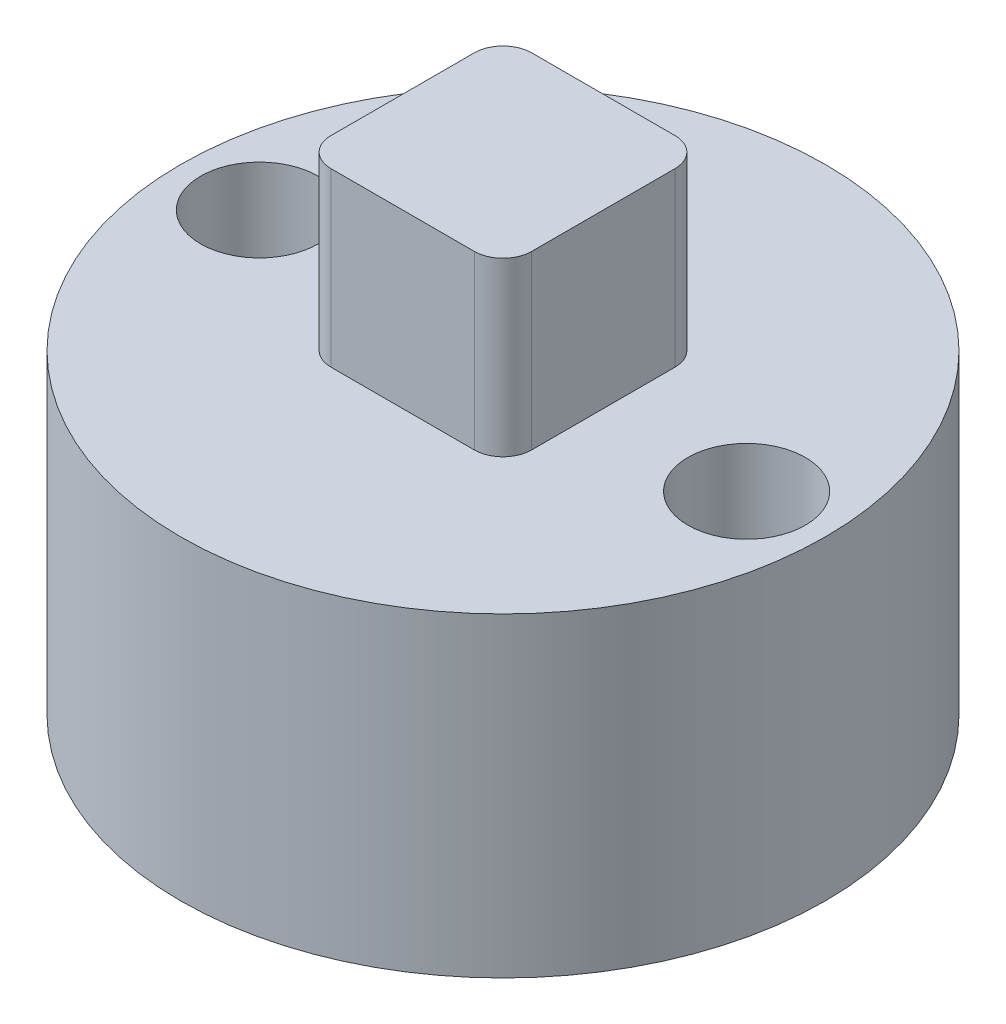
ISO-10303-21;
HEADER;
FILE_DESCRIPTION(('STEP AP214'),'2;1');
FILE_NAME('part.step','',(''),(''),'','','');
FILE_SCHEMA(('AUTOMOTIVE_DESIGN { 1 0 10303 214 1 1 1 1 }'));
ENDSEC;
DATA;
#1=APPLICATION_CONTEXT('core data for automotive mechanical design processes');
#2=APPLICATION_PROTOCOL_DEFINITION('international standard','automotive_design',2000,#1);
#3=PRODUCT_CONTEXT('',#1,'mechanical');
#4=PRODUCT('Part','Part','',(#3));
#5=PRODUCT_RELATED_PRODUCT_CATEGORY('part','',(#4));
#6=PRODUCT_DEFINITION_FORMATION('','',#4);
#7=PRODUCT_DEFINITION_CONTEXT('part definition',#1,'design');
#8=PRODUCT_DEFINITION('design','',#6,#7);
#9=PRODUCT_DEFINITION_SHAPE('','',#8);
#10=(LENGTH_UNIT() NAMED_UNIT(*) SI_UNIT(.MILLI.,.METRE.));
#11=(NAMED_UNIT(*) PLANE_ANGLE_UNIT() SI_UNIT($,.RADIAN.));
#12=(NAMED_UNIT(*) SI_UNIT($,.STERADIAN.) SOLID_ANGLE_UNIT());
#13=UNCERTAINTY_MEASURE_WITH_UNIT(LENGTH_MEASURE(1.E-05),#10,'distance_accuracy_value','');
#14=(GEOMETRIC_REPRESENTATION_CONTEXT(3) GLOBAL_UNCERTAINTY_ASSIGNED_CONTEXT((#13)) GLOBAL_UNIT_ASSIGNED_CONTEXT((#10,
#11,#12)) REPRESENTATION_CONTEXT('',''));
#15=CARTESIAN_POINT('',(0.,0.,0.));
#16=DIRECTION('',(0.,0.,1.));
#17=DIRECTION('',(1.,0.,0.));
#18=AXIS2_PLACEMENT_3D('',#15,#16,#17);
#19=CARTESIAN_POINT('',(-8.5,11.,0.));
#20=DIRECTION('',(0.,-1.,0.));
#21=DIRECTION('',(0.,0.,-1.));
#22=AXIS2_PLACEMENT_3D('',#19,#20,#21);
#23=CYLINDRICAL_SURFACE('',#22,1.15);
#24=CARTESIAN_POINT('',(-8.5,0.,0.));
#25=DIRECTION('',(0.,-1.,0.));
#26=DIRECTION('',(0.,0.,1.));
#27=AXIS2_PLACEMENT_3D('',#24,#25,#26);
#28=CIRCLE('',#27,1.15);
#29=CARTESIAN_POINT('',(-8.5,0.,1.15));
#30=VERTEX_POINT('',#29);
#31=EDGE_CURVE('E139',#30,#30,#28,.T.);
#32=ORIENTED_EDGE('',*,*,#31,.T.);
#33=EDGE_LOOP('',(#32));
#34=FACE_BOUND('',#33,.T.);
#35=CARTESIAN_POINT('',(-8.5,1.5,0.));
#36=DIRECTION('',(0.,1.,0.));
#37=DIRECTION('',(0.,0.,1.));
#38=AXIS2_PLACEMENT_3D('',#35,#36,#37);
#39=CIRCLE('',#38,1.15);
#40=CARTESIAN_POINT('',(-8.5,1.5,1.15));
#41=VERTEX_POINT('',#40);
#42=EDGE_CURVE('E150',#41,#41,#39,.F.);
#43=ORIENTED_EDGE('',*,*,#42,.F.);
#44=EDGE_LOOP('',(#43));
#45=FACE_BOUND('',#44,.T.);
#46=ADVANCED_FACE('F37',(#34,#45),#23,.F.);
#47=CARTESIAN_POINT('',(8.5,11.,0.));
#48=DIRECTION('',(0.,-1.,0.));
#49=DIRECTION('',(0.,0.,-1.));
#50=AXIS2_PLACEMENT_3D('',#47,#48,#49);
#51=CYLINDRICAL_SURFACE('',#50,1.15);
#52=CARTESIAN_POINT('',(8.5,0.,0.));
#53=DIRECTION('',(0.,-1.,0.));
#54=DIRECTION('',(0.,0.,-1.));
#55=AXIS2_PLACEMENT_3D('',#52,#53,#54);
#56=CIRCLE('',#55,1.15);
#57=CARTESIAN_POINT('',(8.5,0.,-1.15));
#58=VERTEX_POINT('',#57);
#59=EDGE_CURVE('E135',#58,#58,#56,.T.);
#60=ORIENTED_EDGE('',*,*,#59,.T.);
#61=EDGE_LOOP('',(#60));
#62=FACE_BOUND('',#61,.T.);
#63=CARTESIAN_POINT('',(8.5,1.5,0.));
#64=DIRECTION('',(0.,1.,0.));
#65=DIRECTION('',(0.,0.,1.));
#66=AXIS2_PLACEMENT_3D('',#63,#64,#65);
#67=CIRCLE('',#66,1.15);
#68=CARTESIAN_POINT('',(8.5,1.5,1.15));
#69=VERTEX_POINT('',#68);
#70=EDGE_CURVE('E147',#69,#69,#67,.F.);
#71=ORIENTED_EDGE('',*,*,#70,.F.);
#72=EDGE_LOOP('',(#71));
#73=FACE_BOUND('',#72,.T.);
#74=ADVANCED_FACE('F211',(#62,#73),#51,.F.);
#75=CARTESIAN_POINT('',(0.,11.,0.));
#76=DIRECTION('',(0.,1.,0.));
#77=DIRECTION('',(0.,0.,1.));
#78=AXIS2_PLACEMENT_3D('',#75,#76,#77);
#79=PLANE('',#78);
#80=CARTESIAN_POINT('',(8.5,11.,0.));
#81=DIRECTION('',(0.,1.,0.));
#82=DIRECTION('',(0.,0.,1.));
#83=AXIS2_PLACEMENT_3D('',#80,#81,#82);
#84=CIRCLE('',#83,2.05);
#85=CARTESIAN_POINT('',(8.5,11.,2.05));
#86=VERTEX_POINT('',#85);
#87=EDGE_CURVE('E368',#86,#86,#84,.T.);
#88=ORIENTED_EDGE('',*,*,#87,.F.);
#89=EDGE_LOOP('',(#88));
#90=FACE_BOUND('',#89,.T.);
#91=CARTESIAN_POINT('',(-8.5,11.,0.));
#92=DIRECTION('',(0.,1.,0.));
#93=DIRECTION('',(0.,0.,1.));
#94=AXIS2_PLACEMENT_3D('',#91,#92,#93);
#95=CIRCLE('',#94,2.05);
#96=CARTESIAN_POINT('',(-8.5,11.,2.05));
#97=VERTEX_POINT('',#96);
#98=EDGE_CURVE('E374',#97,#97,#95,.T.);
#99=ORIENTED_EDGE('',*,*,#98,.F.);
#100=EDGE_LOOP('',(#99));
#101=FACE_BOUND('',#100,.T.);
#102=CARTESIAN_POINT('',(0.,11.,0.));
#103=DIRECTION('',(0.,1.,0.));
#104=DIRECTION('',(0.,0.,1.));
#105=AXIS2_PLACEMENT_3D('',#102,#103,#104);
#106=CIRCLE('',#105,11.25);
#107=CARTESIAN_POINT('',(0.,11.,11.25));
#108=VERTEX_POINT('',#107);
#109=EDGE_CURVE('E142',#108,#108,#106,.T.);
#110=ORIENTED_EDGE('',*,*,#109,.T.);
#111=EDGE_LOOP('',(#110));
#112=FACE_BOUND('',#111,.T.);
#113=DIRECTION('',(-1.,0.,0.));
#114=VECTOR('',#113,1.);
#115=CARTESIAN_POINT('',(-3.5,11.,-3.5));
#116=LINE('',#115,#114);
#117=CARTESIAN_POINT('',(2.5,11.,-3.5));
#118=VERTEX_POINT('',#117);
#119=CARTESIAN_POINT('',(-2.5,11.,-3.5));
#120=VERTEX_POINT('',#119);
#121=EDGE_CURVE('E131',#118,#120,#116,.T.);
#122=ORIENTED_EDGE('',*,*,#121,.F.);
#123=CARTESIAN_POINT('',(2.5,11.,-2.5));
#124=DIRECTION('',(0.,1.,0.));
#125=DIRECTION('',(0.,0.,1.));
#126=AXIS2_PLACEMENT_3D('',#123,#124,#125);
#127=CIRCLE('',#126,1.);
#128=CARTESIAN_POINT('',(3.5,11.,-2.5));
#129=VERTEX_POINT('',#128);
#130=EDGE_CURVE('E45',#118,#129,#127,.F.);
#131=ORIENTED_EDGE('',*,*,#130,.T.);
#132=DIRECTION('',(0.,0.,-1.));
#133=VECTOR('',#132,1.);
#134=CARTESIAN_POINT('',(3.5,11.,3.5));
#135=LINE('',#134,#133);
#136=CARTESIAN_POINT('',(3.5,11.,2.5));
#137=VERTEX_POINT('',#136);
#138=EDGE_CURVE('E154',#137,#129,#135,.T.);
#139=ORIENTED_EDGE('',*,*,#138,.F.);
#140=CARTESIAN_POINT('',(2.5,11.,2.5));
#141=DIRECTION('',(0.,1.,0.));
#142=DIRECTION('',(0.,0.,1.));
#143=AXIS2_PLACEMENT_3D('',#140,#141,#142);
#144=CIRCLE('',#143,1.);
#145=CARTESIAN_POINT('',(2.5,11.,3.5));
#146=VERTEX_POINT('',#145);
#147=EDGE_CURVE('E109',#137,#146,#144,.F.);
#148=ORIENTED_EDGE('',*,*,#147,.T.);
#149=DIRECTION('',(1.,0.,0.));
#150=VECTOR('',#149,1.);
#151=CARTESIAN_POINT('',(-3.5,11.,3.5));
#152=LINE('',#151,#150);
#153=CARTESIAN_POINT('',(-2.5,11.,3.5));
#154=VERTEX_POINT('',#153);
#155=EDGE_CURVE('E116',#154,#146,#152,.T.);
#156=ORIENTED_EDGE('',*,*,#155,.F.);
#157=CARTESIAN_POINT('',(-2.5,11.,2.5));
#158=DIRECTION('',(0.,1.,0.));
#159=DIRECTION('',(0.,0.,1.));
#160=AXIS2_PLACEMENT_3D('',#157,#158,#159);
#161=CIRCLE('',#160,1.);
#162=CARTESIAN_POINT('',(-3.5,11.,2.5));
#163=VERTEX_POINT('',#162);
#164=EDGE_CURVE('E101',#154,#163,#161,.F.);
#165=ORIENTED_EDGE('',*,*,#164,.T.);
#166=DIRECTION('',(0.,0.,1.));
#167=VECTOR('',#166,1.);
#168=CARTESIAN_POINT('',(-3.5,11.,3.5));
#169=LINE('',#168,#167);
#170=CARTESIAN_POINT('',(-3.5,11.,-2.5));
#171=VERTEX_POINT('',#170);
#172=EDGE_CURVE('E126',#171,#163,#169,.T.);
#173=ORIENTED_EDGE('',*,*,#172,.F.);
#174=CARTESIAN_POINT('',(-2.5,11.,-2.5));
#175=DIRECTION('',(0.,1.,0.));
#176=DIRECTION('',(0.,0.,1.));
#177=AXIS2_PLACEMENT_3D('',#174,#175,#176);
#178=CIRCLE('',#177,1.);
#179=EDGE_CURVE('E12',#171,#120,#178,.F.);
#180=ORIENTED_EDGE('',*,*,#179,.T.);
#181=EDGE_LOOP('',(#122,#131,#139,#148,#156,#165,#173,#180));
#182=FACE_BOUND('',#181,.T.);
#183=ADVANCED_FACE('F123',(#90,#101,#112,#182),#79,.T.);
#184=CARTESIAN_POINT('',(0.,11.,0.));
#185=DIRECTION('',(0.,-1.,0.));
#186=DIRECTION('',(0.,0.,-1.));
#187=AXIS2_PLACEMENT_3D('',#184,#185,#186);
#188=CYLINDRICAL_SURFACE('',#187,11.25);
#189=ORIENTED_EDGE('',*,*,#109,.F.);
#190=EDGE_LOOP('',(#189));
#191=FACE_BOUND('',#190,.T.);
#192=CARTESIAN_POINT('',(0.,0.,0.));
#193=DIRECTION('',(0.,1.,0.));
#194=DIRECTION('',(0.,0.,1.));
#195=AXIS2_PLACEMENT_3D('',#192,#193,#194);
#196=CIRCLE('',#195,11.25);
#197=CARTESIAN_POINT('',(0.,0.,11.25));
#198=VERTEX_POINT('',#197);
#199=EDGE_CURVE('E138',#198,#198,#196,.T.);
#200=ORIENTED_EDGE('',*,*,#199,.T.);
#201=EDGE_LOOP('',(#200));
#202=FACE_BOUND('',#201,.T.);
#203=ADVANCED_FACE('F224',(#191,#202),#188,.T.);
#204=CARTESIAN_POINT('',(0.,0.,0.));
#205=DIRECTION('',(0.,1.,0.));
#206=DIRECTION('',(0.,0.,1.));
#207=AXIS2_PLACEMENT_3D('',#204,#205,#206);
#208=PLANE('',#207);
#209=ORIENTED_EDGE('',*,*,#59,.F.);
#210=EDGE_LOOP('',(#209));
#211=FACE_BOUND('',#210,.T.);
#212=ORIENTED_EDGE('',*,*,#31,.F.);
#213=EDGE_LOOP('',(#212));
#214=FACE_BOUND('',#213,.T.);
#215=ORIENTED_EDGE('',*,*,#199,.F.);
#216=EDGE_LOOP('',(#215));
#217=FACE_BOUND('',#216,.T.);
#218=ADVANCED_FACE('F226',(#211,#214,#217),#208,.F.);
#219=CARTESIAN_POINT('',(3.5,17.,3.5));
#220=DIRECTION('',(-1.,0.,0.));
#221=DIRECTION('',(0.,0.,1.));
#222=AXIS2_PLACEMENT_3D('',#219,#220,#221);
#223=PLANE('',#222);
#224=DIRECTION('',(0.,0.,-1.));
#225=VECTOR('',#224,1.);
#226=CARTESIAN_POINT('',(3.5,17.,3.5));
#227=LINE('',#226,#225);
#228=CARTESIAN_POINT('',(3.5,17.,2.5));
#229=VERTEX_POINT('',#228);
#230=CARTESIAN_POINT('',(3.5,17.,-2.5));
#231=VERTEX_POINT('',#230);
#232=EDGE_CURVE('E125',#229,#231,#227,.T.);
#233=ORIENTED_EDGE('',*,*,#232,.F.);
#234=DIRECTION('',(0.,-1.,0.));
#235=VECTOR('',#234,1.);
#236=CARTESIAN_POINT('',(3.5,17.,2.5));
#237=LINE('',#236,#235);
#238=EDGE_CURVE('E169',#229,#137,#237,.T.);
#239=ORIENTED_EDGE('',*,*,#238,.T.);
#240=ORIENTED_EDGE('',*,*,#138,.T.);
#241=DIRECTION('',(0.,-1.,0.));
#242=VECTOR('',#241,1.);
#243=CARTESIAN_POINT('',(3.5,17.,-2.5));
#244=LINE('',#243,#242);
#245=EDGE_CURVE('E167',#129,#231,#244,.F.);
#246=ORIENTED_EDGE('',*,*,#245,.T.);
#247=EDGE_LOOP('',(#233,#239,#240,#246));
#248=FACE_BOUND('',#247,.T.);
#249=ADVANCED_FACE('F178',(#248),#223,.F.);
#250=CARTESIAN_POINT('',(-3.5,17.,-3.5));
#251=DIRECTION('',(0.,0.,1.));
#252=DIRECTION('',(1.,0.,0.));
#253=AXIS2_PLACEMENT_3D('',#250,#251,#252);
#254=PLANE('',#253);
#255=DIRECTION('',(-1.,0.,0.));
#256=VECTOR('',#255,1.);
#257=CARTESIAN_POINT('',(-3.5,17.,-3.5));
#258=LINE('',#257,#256);
#259=CARTESIAN_POINT('',(2.5,17.,-3.5));
#260=VERTEX_POINT('',#259);
#261=CARTESIAN_POINT('',(-2.5,17.,-3.5));
#262=VERTEX_POINT('',#261);
#263=EDGE_CURVE('E129',#260,#262,#258,.T.);
#264=ORIENTED_EDGE('',*,*,#263,.F.);
#265=DIRECTION('',(0.,-1.,0.));
#266=VECTOR('',#265,1.);
#267=CARTESIAN_POINT('',(2.5,17.,-3.5));
#268=LINE('',#267,#266);
#269=EDGE_CURVE('E110',#260,#118,#268,.T.);
#270=ORIENTED_EDGE('',*,*,#269,.T.);
#271=ORIENTED_EDGE('',*,*,#121,.T.);
#272=DIRECTION('',(0.,-1.,0.));
#273=VECTOR('',#272,1.);
#274=CARTESIAN_POINT('',(-2.5,17.,-3.5));
#275=LINE('',#274,#273);
#276=EDGE_CURVE('E172',#120,#262,#275,.F.);
#277=ORIENTED_EDGE('',*,*,#276,.T.);
#278=EDGE_LOOP('',(#264,#270,#271,#277));
#279=FACE_BOUND('',#278,.T.);
#280=ADVANCED_FACE('F190',(#279),#254,.F.);
#281=CARTESIAN_POINT('',(-3.5,17.,3.5));
#282=DIRECTION('',(1.,0.,0.));
#283=DIRECTION('',(0.,0.,-1.));
#284=AXIS2_PLACEMENT_3D('',#281,#282,#283);
#285=PLANE('',#284);
#286=ORIENTED_EDGE('',*,*,#172,.T.);
#287=DIRECTION('',(0.,-1.,0.));
#288=VECTOR('',#287,1.);
#289=CARTESIAN_POINT('',(-3.5,17.,2.5));
#290=LINE('',#289,#288);
#291=CARTESIAN_POINT('',(-3.5,17.,2.5));
#292=VERTEX_POINT('',#291);
#293=EDGE_CURVE('E106',#163,#292,#290,.F.);
#294=ORIENTED_EDGE('',*,*,#293,.T.);
#295=DIRECTION('',(0.,0.,1.));
#296=VECTOR('',#295,1.);
#297=CARTESIAN_POINT('',(-3.5,17.,3.5));
#298=LINE('',#297,#296);
#299=CARTESIAN_POINT('',(-3.5,17.,-2.5));
#300=VERTEX_POINT('',#299);
#301=EDGE_CURVE('E192',#300,#292,#298,.T.);
#302=ORIENTED_EDGE('',*,*,#301,.F.);
#303=DIRECTION('',(0.,-1.,0.));
#304=VECTOR('',#303,1.);
#305=CARTESIAN_POINT('',(-3.5,17.,-2.5));
#306=LINE('',#305,#304);
#307=EDGE_CURVE('E120',#300,#171,#306,.T.);
#308=ORIENTED_EDGE('',*,*,#307,.T.);
#309=EDGE_LOOP('',(#286,#294,#302,#308));
#310=FACE_BOUND('',#309,.T.);
#311=ADVANCED_FACE('F201',(#310),#285,.F.);
#312=CARTESIAN_POINT('',(-3.5,17.,3.5));
#313=DIRECTION('',(0.,0.,-1.));
#314=DIRECTION('',(-1.,0.,0.));
#315=AXIS2_PLACEMENT_3D('',#312,#313,#314);
#316=PLANE('',#315);
#317=DIRECTION('',(1.,0.,0.));
#318=VECTOR('',#317,1.);
#319=CARTESIAN_POINT('',(-3.5,17.,3.5));
#320=LINE('',#319,#318);
#321=CARTESIAN_POINT('',(-2.5,17.,3.5));
#322=VERTEX_POINT('',#321);
#323=CARTESIAN_POINT('',(2.5,17.,3.5));
#324=VERTEX_POINT('',#323);
#325=EDGE_CURVE('E119',#322,#324,#320,.T.);
#326=ORIENTED_EDGE('',*,*,#325,.F.);
#327=DIRECTION('',(0.,-1.,0.));
#328=VECTOR('',#327,1.);
#329=CARTESIAN_POINT('',(-2.5,17.,3.5));
#330=LINE('',#329,#328);
#331=EDGE_CURVE('E105',#322,#154,#330,.T.);
#332=ORIENTED_EDGE('',*,*,#331,.T.);
#333=ORIENTED_EDGE('',*,*,#155,.T.);
#334=DIRECTION('',(0.,-1.,0.));
#335=VECTOR('',#334,1.);
#336=CARTESIAN_POINT('',(2.5,17.,3.5));
#337=LINE('',#336,#335);
#338=EDGE_CURVE('E121',#146,#324,#337,.F.);
#339=ORIENTED_EDGE('',*,*,#338,.T.);
#340=EDGE_LOOP('',(#326,#332,#333,#339));
#341=FACE_BOUND('',#340,.T.);
#342=ADVANCED_FACE('F115',(#341),#316,.F.);
#343=CARTESIAN_POINT('',(0.,17.,0.));
#344=DIRECTION('',(0.,-1.,0.));
#345=DIRECTION('',(0.,0.,-1.));
#346=AXIS2_PLACEMENT_3D('',#343,#344,#345);
#347=PLANE('',#346);
#348=ORIENTED_EDGE('',*,*,#301,.T.);
#349=CARTESIAN_POINT('',(-2.5,17.,2.5));
#350=DIRECTION('',(0.,-1.,0.));
#351=DIRECTION('',(0.,0.,-1.));
#352=AXIS2_PLACEMENT_3D('',#349,#350,#351);
#353=CIRCLE('',#352,1.);
#354=EDGE_CURVE('E165',#292,#322,#353,.F.);
#355=ORIENTED_EDGE('',*,*,#354,.T.);
#356=ORIENTED_EDGE('',*,*,#325,.T.);
#357=CARTESIAN_POINT('',(2.5,17.,2.5));
#358=DIRECTION('',(0.,-1.,0.));
#359=DIRECTION('',(0.,0.,-1.));
#360=AXIS2_PLACEMENT_3D('',#357,#358,#359);
#361=CIRCLE('',#360,1.);
#362=EDGE_CURVE('E163',#324,#229,#361,.F.);
#363=ORIENTED_EDGE('',*,*,#362,.T.);
#364=ORIENTED_EDGE('',*,*,#232,.T.);
#365=CARTESIAN_POINT('',(2.5,17.,-2.5));
#366=DIRECTION('',(0.,-1.,0.));
#367=DIRECTION('',(0.,0.,-1.));
#368=AXIS2_PLACEMENT_3D('',#365,#366,#367);
#369=CIRCLE('',#368,1.);
#370=EDGE_CURVE('E161',#231,#260,#369,.F.);
#371=ORIENTED_EDGE('',*,*,#370,.T.);
#372=ORIENTED_EDGE('',*,*,#263,.T.);
#373=CARTESIAN_POINT('',(-2.5,17.,-2.5));
#374=DIRECTION('',(0.,-1.,0.));
#375=DIRECTION('',(0.,0.,-1.));
#376=AXIS2_PLACEMENT_3D('',#373,#374,#375);
#377=CIRCLE('',#376,1.);
#378=EDGE_CURVE('E159',#262,#300,#377,.F.);
#379=ORIENTED_EDGE('',*,*,#378,.T.);
#380=EDGE_LOOP('',(#348,#355,#356,#363,#364,#371,#372,#379));
#381=FACE_BOUND('',#380,.T.);
#382=ADVANCED_FACE('F187',(#381),#347,.F.);
#383=CARTESIAN_POINT('',(0.,1.5,0.));
#384=DIRECTION('',(0.,1.,0.));
#385=DIRECTION('',(0.,0.,1.));
#386=AXIS2_PLACEMENT_3D('',#383,#384,#385);
#387=PLANE('',#386);
#388=CARTESIAN_POINT('',(8.5,1.5,0.));
#389=DIRECTION('',(0.,1.,0.));
#390=DIRECTION('',(0.,0.,1.));
#391=AXIS2_PLACEMENT_3D('',#388,#389,#390);
#392=CIRCLE('',#391,2.05);
#393=CARTESIAN_POINT('',(8.5,1.5,2.05));
#394=VERTEX_POINT('',#393);
#395=EDGE_CURVE('E151',#394,#394,#392,.F.);
#396=ORIENTED_EDGE('',*,*,#395,.F.);
#397=EDGE_LOOP('',(#396));
#398=FACE_BOUND('',#397,.T.);
#399=ORIENTED_EDGE('',*,*,#70,.T.);
#400=EDGE_LOOP('',(#399));
#401=FACE_BOUND('',#400,.T.);
#402=ADVANCED_FACE('F272',(#398,#401),#387,.T.);
#403=CARTESIAN_POINT('',(8.5,-5.79827560572969,0.));
#404=DIRECTION('',(0.,1.,0.));
#405=DIRECTION('',(0.,0.,1.));
#406=AXIS2_PLACEMENT_3D('',#403,#404,#405);
#407=CYLINDRICAL_SURFACE('',#406,2.05);
#408=ORIENTED_EDGE('',*,*,#395,.T.);
#409=EDGE_LOOP('',(#408));
#410=FACE_BOUND('',#409,.T.);
#411=ORIENTED_EDGE('',*,*,#87,.T.);
#412=EDGE_LOOP('',(#411));
#413=FACE_BOUND('',#412,.T.);
#414=ADVANCED_FACE('F321',(#410,#413),#407,.F.);
#415=CARTESIAN_POINT('',(0.,1.5,0.));
#416=DIRECTION('',(0.,1.,0.));
#417=DIRECTION('',(0.,0.,1.));
#418=AXIS2_PLACEMENT_3D('',#415,#416,#417);
#419=PLANE('',#418);
#420=CARTESIAN_POINT('',(-8.5,1.5,0.));
#421=DIRECTION('',(0.,1.,0.));
#422=DIRECTION('',(0.,0.,1.));
#423=AXIS2_PLACEMENT_3D('',#420,#421,#422);
#424=CIRCLE('',#423,2.05);
#425=CARTESIAN_POINT('',(-8.5,1.5,2.05));
#426=VERTEX_POINT('',#425);
#427=EDGE_CURVE('E371',#426,#426,#424,.F.);
#428=ORIENTED_EDGE('',*,*,#427,.F.);
#429=EDGE_LOOP('',(#428));
#430=FACE_BOUND('',#429,.T.);
#431=ORIENTED_EDGE('',*,*,#42,.T.);
#432=EDGE_LOOP('',(#431));
#433=FACE_BOUND('',#432,.T.);
#434=ADVANCED_FACE('F311',(#430,#433),#419,.T.);
#435=CARTESIAN_POINT('',(-8.5,-5.79827560572969,0.));
#436=DIRECTION('',(0.,1.,0.));
#437=DIRECTION('',(0.,0.,1.));
#438=AXIS2_PLACEMENT_3D('',#435,#436,#437);
#439=CYLINDRICAL_SURFACE('',#438,2.05);
#440=ORIENTED_EDGE('',*,*,#427,.T.);
#441=EDGE_LOOP('',(#440));
#442=FACE_BOUND('',#441,.T.);
#443=ORIENTED_EDGE('',*,*,#98,.T.);
#444=EDGE_LOOP('',(#443));
#445=FACE_BOUND('',#444,.T.);
#446=ADVANCED_FACE('F236',(#442,#445),#439,.F.);
#447=CARTESIAN_POINT('',(-2.5,17.,2.5));
#448=DIRECTION('',(0.,-1.,0.));
#449=DIRECTION('',(0.,0.,-1.));
#450=AXIS2_PLACEMENT_3D('',#447,#448,#449);
#451=CYLINDRICAL_SURFACE('',#450,1.);
#452=ORIENTED_EDGE('',*,*,#354,.F.);
#453=ORIENTED_EDGE('',*,*,#293,.F.);
#454=ORIENTED_EDGE('',*,*,#164,.F.);
#455=ORIENTED_EDGE('',*,*,#331,.F.);
#456=EDGE_LOOP('',(#452,#453,#454,#455));
#457=FACE_BOUND('',#456,.T.);
#458=ADVANCED_FACE('F104',(#457),#451,.T.);
#459=CARTESIAN_POINT('',(2.5,17.,2.5));
#460=DIRECTION('',(0.,-1.,0.));
#461=DIRECTION('',(0.,0.,-1.));
#462=AXIS2_PLACEMENT_3D('',#459,#460,#461);
#463=CYLINDRICAL_SURFACE('',#462,1.);
#464=ORIENTED_EDGE('',*,*,#362,.F.);
#465=ORIENTED_EDGE('',*,*,#338,.F.);
#466=ORIENTED_EDGE('',*,*,#147,.F.);
#467=ORIENTED_EDGE('',*,*,#238,.F.);
#468=EDGE_LOOP('',(#464,#465,#466,#467));
#469=FACE_BOUND('',#468,.T.);
#470=ADVANCED_FACE('F235',(#469),#463,.T.);
#471=CARTESIAN_POINT('',(2.5,17.,-2.5));
#472=DIRECTION('',(0.,-1.,0.));
#473=DIRECTION('',(0.,0.,-1.));
#474=AXIS2_PLACEMENT_3D('',#471,#472,#473);
#475=CYLINDRICAL_SURFACE('',#474,1.);
#476=ORIENTED_EDGE('',*,*,#370,.F.);
#477=ORIENTED_EDGE('',*,*,#245,.F.);
#478=ORIENTED_EDGE('',*,*,#130,.F.);
#479=ORIENTED_EDGE('',*,*,#269,.F.);
#480=EDGE_LOOP('',(#476,#477,#478,#479));
#481=FACE_BOUND('',#480,.T.);
#482=ADVANCED_FACE('F182',(#481),#475,.T.);
#483=CARTESIAN_POINT('',(-2.5,17.,-2.5));
#484=DIRECTION('',(0.,-1.,0.));
#485=DIRECTION('',(0.,0.,-1.));
#486=AXIS2_PLACEMENT_3D('',#483,#484,#485);
#487=CYLINDRICAL_SURFACE('',#486,1.);
#488=ORIENTED_EDGE('',*,*,#378,.F.);
#489=ORIENTED_EDGE('',*,*,#276,.F.);
#490=ORIENTED_EDGE('',*,*,#179,.F.);
#491=ORIENTED_EDGE('',*,*,#307,.F.);
#492=EDGE_LOOP('',(#488,#489,#490,#491));
#493=FACE_BOUND('',#492,.T.);
#494=ADVANCED_FACE('F39',(#493),#487,.T.);
#495=CLOSED_SHELL('',(#46,#74,#183,#203,#218,#249,#280,#311,#342,#382,#402,#414,#434,#446,#458,
#470,#482,#494));
#496=MANIFOLD_SOLID_BREP('B2',#495);
#497=ADVANCED_BREP_SHAPE_REPRESENTATION('',(#18,#496),#14);
#498=SHAPE_DEFINITION_REPRESENTATION(#9,#497);
ENDSEC;
END-ISO-10303-21;
